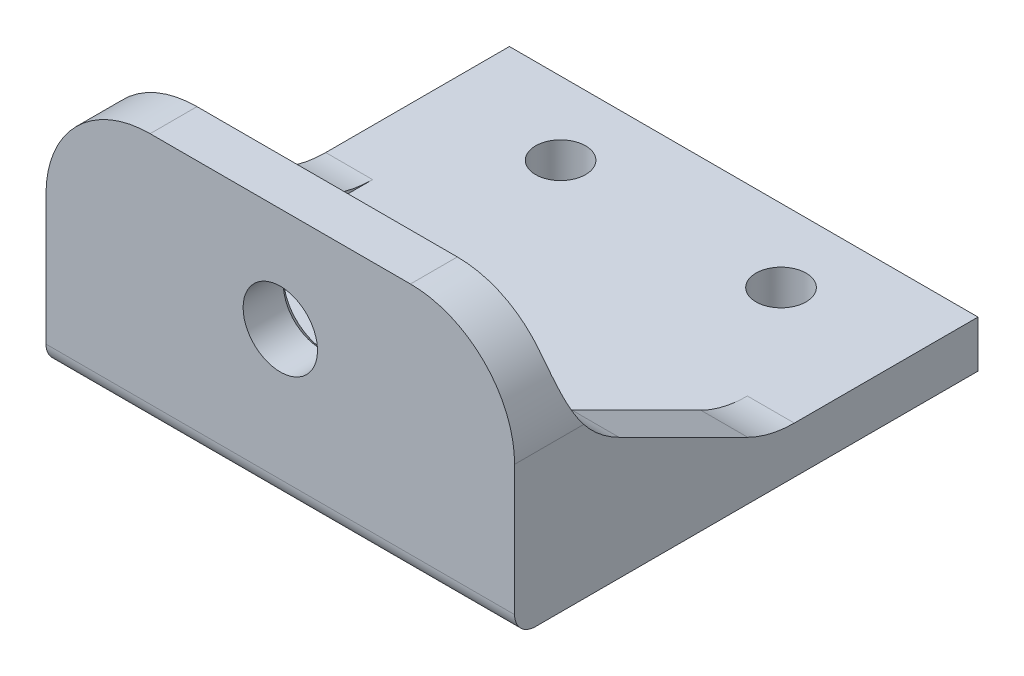
ISO-10303-21;
HEADER;
FILE_DESCRIPTION(('STEP AP214'),'2;1');
FILE_NAME('part.step','',(''),(''),'','','');
FILE_SCHEMA(('AUTOMOTIVE_DESIGN { 1 0 10303 214 1 1 1 1 }'));
ENDSEC;
DATA;
#1=APPLICATION_CONTEXT('core data for automotive mechanical design processes');
#2=APPLICATION_PROTOCOL_DEFINITION('international standard','automotive_design',2000,#1);
#3=PRODUCT_CONTEXT('',#1,'mechanical');
#4=PRODUCT('Part','Part','',(#3));
#5=PRODUCT_RELATED_PRODUCT_CATEGORY('part','',(#4));
#6=PRODUCT_DEFINITION_FORMATION('','',#4);
#7=PRODUCT_DEFINITION_CONTEXT('part definition',#1,'design');
#8=PRODUCT_DEFINITION('design','',#6,#7);
#9=PRODUCT_DEFINITION_SHAPE('','',#8);
#10=(LENGTH_UNIT() NAMED_UNIT(*) SI_UNIT(.MILLI.,.METRE.));
#11=(NAMED_UNIT(*) PLANE_ANGLE_UNIT() SI_UNIT($,.RADIAN.));
#12=(NAMED_UNIT(*) SI_UNIT($,.STERADIAN.) SOLID_ANGLE_UNIT());
#13=UNCERTAINTY_MEASURE_WITH_UNIT(LENGTH_MEASURE(1.E-05),#10,'distance_accuracy_value','');
#14=(GEOMETRIC_REPRESENTATION_CONTEXT(3) GLOBAL_UNCERTAINTY_ASSIGNED_CONTEXT((#13)) GLOBAL_UNIT_ASSIGNED_CONTEXT((#10,
#11,#12)) REPRESENTATION_CONTEXT('',''));
#15=CARTESIAN_POINT('',(0.,0.,0.));
#16=DIRECTION('',(0.,0.,1.));
#17=DIRECTION('',(1.,0.,0.));
#18=AXIS2_PLACEMENT_3D('',#15,#16,#17);
#19=CARTESIAN_POINT('',(0.,4.5,0.));
#20=DIRECTION('',(0.,1.,0.));
#21=DIRECTION('',(0.,0.,1.));
#22=AXIS2_PLACEMENT_3D('',#19,#20,#21);
#23=PLANE('',#22);
#24=CARTESIAN_POINT('',(-10.58478565,4.5,44.5));
#25=DIRECTION('',(0.,1.,0.));
#26=DIRECTION('',(0.,0.,1.));
#27=AXIS2_PLACEMENT_3D('',#24,#25,#26);
#28=CIRCLE('',#27,2.4);
#29=CARTESIAN_POINT('',(-10.58478565,4.5,46.9));
#30=VERTEX_POINT('',#29);
#31=EDGE_CURVE('E369',#30,#30,#28,.T.);
#32=ORIENTED_EDGE('',*,*,#31,.F.);
#33=EDGE_LOOP('',(#32));
#34=FACE_BOUND('',#33,.T.);
#35=CARTESIAN_POINT('',(10.58478565,4.5,44.5));
#36=DIRECTION('',(0.,1.,0.));
#37=DIRECTION('',(0.,0.,1.));
#38=AXIS2_PLACEMENT_3D('',#35,#36,#37);
#39=CIRCLE('',#38,2.4);
#40=CARTESIAN_POINT('',(10.58478565,4.5,46.9));
#41=VERTEX_POINT('',#40);
#42=EDGE_CURVE('E363',#41,#41,#39,.T.);
#43=ORIENTED_EDGE('',*,*,#42,.F.);
#44=EDGE_LOOP('',(#43));
#45=FACE_BOUND('',#44,.T.);
#46=DIRECTION('',(0.,0.,1.));
#47=VECTOR('',#46,1.);
#48=CARTESIAN_POINT('',(18.,4.5,57.5));
#49=LINE('',#48,#47);
#50=CARTESIAN_POINT('',(18.,4.5,55.1393202250021));
#51=VERTEX_POINT('',#50);
#52=CARTESIAN_POINT('',(18.,4.5,75.5));
#53=VERTEX_POINT('',#52);
#54=EDGE_CURVE('E165',#51,#53,#49,.T.);
#55=ORIENTED_EDGE('',*,*,#54,.F.);
#56=DIRECTION('',(1.,0.,0.));
#57=VECTOR('',#56,1.);
#58=CARTESIAN_POINT('',(0.,4.5,55.1393202250021));
#59=LINE('',#58,#57);
#60=CARTESIAN_POINT('',(22.5,4.5,55.1393202250021));
#61=VERTEX_POINT('',#60);
#62=EDGE_CURVE('E170',#51,#61,#59,.T.);
#63=ORIENTED_EDGE('',*,*,#62,.T.);
#64=DIRECTION('',(0.,0.,-1.));
#65=VECTOR('',#64,1.);
#66=CARTESIAN_POINT('',(22.5,4.5,77.5));
#67=LINE('',#66,#65);
#68=CARTESIAN_POINT('',(22.5,4.5,37.5));
#69=VERTEX_POINT('',#68);
#70=EDGE_CURVE('E336',#61,#69,#67,.T.);
#71=ORIENTED_EDGE('',*,*,#70,.T.);
#72=DIRECTION('',(-1.,0.,0.));
#73=VECTOR('',#72,1.);
#74=CARTESIAN_POINT('',(0.,4.5,37.5));
#75=LINE('',#74,#73);
#76=CARTESIAN_POINT('',(-22.5,4.5,37.5));
#77=VERTEX_POINT('',#76);
#78=EDGE_CURVE('E357',#69,#77,#75,.T.);
#79=ORIENTED_EDGE('',*,*,#78,.T.);
#80=DIRECTION('',(0.,0.,1.));
#81=VECTOR('',#80,1.);
#82=CARTESIAN_POINT('',(-22.5,4.5,77.5));
#83=LINE('',#82,#81);
#84=CARTESIAN_POINT('',(-22.5,4.5,55.1393202250021));
#85=VERTEX_POINT('',#84);
#86=EDGE_CURVE('E333',#77,#85,#83,.T.);
#87=ORIENTED_EDGE('',*,*,#86,.T.);
#88=DIRECTION('',(-1.,0.,0.));
#89=VECTOR('',#88,1.);
#90=CARTESIAN_POINT('',(-18.,4.5,55.1393202250021));
#91=LINE('',#90,#89);
#92=CARTESIAN_POINT('',(-18.,4.5,55.1393202250021));
#93=VERTEX_POINT('',#92);
#94=EDGE_CURVE('E200',#85,#93,#91,.F.);
#95=ORIENTED_EDGE('',*,*,#94,.T.);
#96=DIRECTION('',(0.,0.,1.));
#97=VECTOR('',#96,1.);
#98=CARTESIAN_POINT('',(-18.,4.5,57.5));
#99=LINE('',#98,#97);
#100=CARTESIAN_POINT('',(-18.,4.5,75.5));
#101=VERTEX_POINT('',#100);
#102=EDGE_CURVE('E374',#93,#101,#99,.T.);
#103=ORIENTED_EDGE('',*,*,#102,.T.);
#104=DIRECTION('',(1.,0.,0.));
#105=VECTOR('',#104,1.);
#106=CARTESIAN_POINT('',(0.,4.5,75.5));
#107=LINE('',#106,#105);
#108=EDGE_CURVE('E187',#101,#53,#107,.T.);
#109=ORIENTED_EDGE('',*,*,#108,.T.);
#110=EDGE_LOOP('',(#55,#63,#71,#79,#87,#95,#103,#109));
#111=FACE_BOUND('',#110,.T.);
#112=ADVANCED_FACE('F38',(#34,#45,#111),#23,.T.);
#113=CARTESIAN_POINT('',(0.,0.,77.5));
#114=DIRECTION('',(0.,0.,1.));
#115=DIRECTION('',(1.,0.,0.));
#116=AXIS2_PLACEMENT_3D('',#113,#114,#115);
#117=PLANE('',#116);
#118=CARTESIAN_POINT('',(0.,14.5,77.5));
#119=DIRECTION('',(0.,0.,-1.));
#120=DIRECTION('',(-1.,0.,0.));
#121=AXIS2_PLACEMENT_3D('',#118,#119,#120);
#122=CIRCLE('',#121,4.20624);
#123=CARTESIAN_POINT('',(-4.20624,14.5,77.5));
#124=VERTEX_POINT('',#123);
#125=EDGE_CURVE('E354',#124,#124,#122,.T.);
#126=ORIENTED_EDGE('',*,*,#125,.F.);
#127=EDGE_LOOP('',(#126));
#128=FACE_BOUND('',#127,.T.);
#129=CARTESIAN_POINT('',(12.5,14.5,77.5));
#130=DIRECTION('',(0.,0.,1.));
#131=DIRECTION('',(1.,0.,0.));
#132=AXIS2_PLACEMENT_3D('',#129,#130,#131);
#133=CIRCLE('',#132,10.);
#134=CARTESIAN_POINT('',(12.5,24.5,77.5));
#135=VERTEX_POINT('',#134);
#136=CARTESIAN_POINT('',(20.3615137775742,20.680339887499,77.5));
#137=VERTEX_POINT('',#136);
#138=EDGE_CURVE('E287',#135,#137,#133,.F.);
#139=ORIENTED_EDGE('',*,*,#138,.T.);
#140=DIRECTION('',(1.,0.,0.));
#141=VECTOR('',#140,1.);
#142=CARTESIAN_POINT('',(18.,20.680339887499,77.5));
#143=LINE('',#142,#141);
#144=CARTESIAN_POINT('',(18.,20.680339887499,77.5));
#145=VERTEX_POINT('',#144);
#146=EDGE_CURVE('E179',#137,#145,#143,.F.);
#147=ORIENTED_EDGE('',*,*,#146,.T.);
#148=DIRECTION('',(0.,1.,0.));
#149=VECTOR('',#148,1.);
#150=CARTESIAN_POINT('',(18.,4.5,77.5));
#151=LINE('',#150,#149);
#152=CARTESIAN_POINT('',(18.,6.5,77.5));
#153=VERTEX_POINT('',#152);
#154=EDGE_CURVE('E61',#153,#145,#151,.T.);
#155=ORIENTED_EDGE('',*,*,#154,.F.);
#156=DIRECTION('',(1.,0.,0.));
#157=VECTOR('',#156,1.);
#158=CARTESIAN_POINT('',(0.,6.5,77.5));
#159=LINE('',#158,#157);
#160=CARTESIAN_POINT('',(-18.,6.5,77.5));
#161=VERTEX_POINT('',#160);
#162=EDGE_CURVE('E176',#153,#161,#159,.F.);
#163=ORIENTED_EDGE('',*,*,#162,.T.);
#164=DIRECTION('',(0.,1.,0.));
#165=VECTOR('',#164,1.);
#166=CARTESIAN_POINT('',(-18.,4.5,77.5));
#167=LINE('',#166,#165);
#168=CARTESIAN_POINT('',(-18.,20.680339887499,77.5));
#169=VERTEX_POINT('',#168);
#170=EDGE_CURVE('E276',#161,#169,#167,.T.);
#171=ORIENTED_EDGE('',*,*,#170,.T.);
#172=DIRECTION('',(-1.,0.,0.));
#173=VECTOR('',#172,1.);
#174=CARTESIAN_POINT('',(0.,20.680339887499,77.5));
#175=LINE('',#174,#173);
#176=CARTESIAN_POINT('',(-20.3615137775742,20.680339887499,77.5));
#177=VERTEX_POINT('',#176);
#178=EDGE_CURVE('E203',#169,#177,#175,.T.);
#179=ORIENTED_EDGE('',*,*,#178,.T.);
#180=CARTESIAN_POINT('',(-12.5,14.5,77.5));
#181=DIRECTION('',(0.,0.,1.));
#182=DIRECTION('',(1.,0.,0.));
#183=AXIS2_PLACEMENT_3D('',#180,#181,#182);
#184=CIRCLE('',#183,10.);
#185=CARTESIAN_POINT('',(-12.5,24.5,77.5));
#186=VERTEX_POINT('',#185);
#187=EDGE_CURVE('E281',#177,#186,#184,.F.);
#188=ORIENTED_EDGE('',*,*,#187,.T.);
#189=DIRECTION('',(-1.,0.,0.));
#190=VECTOR('',#189,1.);
#191=CARTESIAN_POINT('',(22.5,24.5,77.5));
#192=LINE('',#191,#190);
#193=EDGE_CURVE('E344',#135,#186,#192,.T.);
#194=ORIENTED_EDGE('',*,*,#193,.F.);
#195=EDGE_LOOP('',(#139,#147,#155,#163,#171,#179,#188,#194));
#196=FACE_BOUND('',#195,.T.);
#197=ADVANCED_FACE('F175',(#128,#196),#117,.F.);
#198=CARTESIAN_POINT('',(-22.5,4.5,77.5));
#199=DIRECTION('',(1.,0.,0.));
#200=DIRECTION('',(0.,0.,-1.));
#201=AXIS2_PLACEMENT_3D('',#198,#199,#200);
#202=PLANE('',#201);
#203=DIRECTION('',(0.,0.,-1.));
#204=VECTOR('',#203,1.);
#205=CARTESIAN_POINT('',(-22.5,14.5,77.5));
#206=LINE('',#205,#204);
#207=CARTESIAN_POINT('',(-22.5,14.5,82.));
#208=VERTEX_POINT('',#207);
#209=CARTESIAN_POINT('',(-22.5,14.5,75.3615137775742));
#210=VERTEX_POINT('',#209);
#211=EDGE_CURVE('E269',#208,#210,#206,.T.);
#212=ORIENTED_EDGE('',*,*,#211,.T.);
#213=CARTESIAN_POINT('',(-22.5,20.680339887499,67.5));
#214=DIRECTION('',(1.,0.,0.));
#215=DIRECTION('',(0.,0.,-1.));
#216=AXIS2_PLACEMENT_3D('',#213,#214,#215);
#217=CIRCLE('',#216,10.);
#218=CARTESIAN_POINT('',(-22.5,11.7360679774998,71.9721359549996));
#219=VERTEX_POINT('',#218);
#220=EDGE_CURVE('E219',#210,#219,#217,.T.);
#221=ORIENTED_EDGE('',*,*,#220,.T.);
#222=DIRECTION('',(0.,-0.447213595499958,-0.894427190999916));
#223=VECTOR('',#222,1.);
#224=CARTESIAN_POINT('',(-22.5,14.5,77.5));
#225=LINE('',#224,#223);
#226=CARTESIAN_POINT('',(-22.5,5.55572809000084,59.6114561800017));
#227=VERTEX_POINT('',#226);
#228=EDGE_CURVE('E266',#219,#227,#225,.T.);
#229=ORIENTED_EDGE('',*,*,#228,.T.);
#230=CARTESIAN_POINT('',(-22.5,14.5,55.1393202250021));
#231=DIRECTION('',(1.,0.,0.));
#232=DIRECTION('',(0.,0.,-1.));
#233=AXIS2_PLACEMENT_3D('',#230,#231,#232);
#234=CIRCLE('',#233,10.);
#235=EDGE_CURVE('E206',#227,#85,#234,.T.);
#236=ORIENTED_EDGE('',*,*,#235,.T.);
#237=ORIENTED_EDGE('',*,*,#86,.F.);
#238=DIRECTION('',(0.,1.,0.));
#239=VECTOR('',#238,1.);
#240=CARTESIAN_POINT('',(-22.5,4.5,37.5));
#241=LINE('',#240,#239);
#242=CARTESIAN_POINT('',(-22.5,0.,37.5));
#243=VERTEX_POINT('',#242);
#244=EDGE_CURVE('E359',#243,#77,#241,.T.);
#245=ORIENTED_EDGE('',*,*,#244,.F.);
#246=DIRECTION('',(0.,0.,1.));
#247=VECTOR('',#246,1.);
#248=CARTESIAN_POINT('',(-22.5,0.,77.5));
#249=LINE('',#248,#247);
#250=CARTESIAN_POINT('',(-22.5,0.,80.));
#251=VERTEX_POINT('',#250);
#252=EDGE_CURVE('E312',#243,#251,#249,.T.);
#253=ORIENTED_EDGE('',*,*,#252,.T.);
#254=CARTESIAN_POINT('',(-22.5,2.,80.));
#255=DIRECTION('',(1.,0.,0.));
#256=DIRECTION('',(0.,0.,-1.));
#257=AXIS2_PLACEMENT_3D('',#254,#255,#256);
#258=CIRCLE('',#257,2.);
#259=CARTESIAN_POINT('',(-22.5,2.,82.));
#260=VERTEX_POINT('',#259);
#261=EDGE_CURVE('E190',#251,#260,#258,.F.);
#262=ORIENTED_EDGE('',*,*,#261,.T.);
#263=DIRECTION('',(0.,-1.,0.));
#264=VECTOR('',#263,1.);
#265=CARTESIAN_POINT('',(-22.5,0.,82.));
#266=LINE('',#265,#264);
#267=EDGE_CURVE('E309',#208,#260,#266,.T.);
#268=ORIENTED_EDGE('',*,*,#267,.F.);
#269=EDGE_LOOP('',(#212,#221,#229,#236,#237,#245,#253,#262,#268));
#270=FACE_BOUND('',#269,.T.);
#271=ADVANCED_FACE('F232',(#270),#202,.F.);
#272=CARTESIAN_POINT('',(22.5,4.5,77.5));
#273=DIRECTION('',(-1.,0.,0.));
#274=DIRECTION('',(0.,0.,1.));
#275=AXIS2_PLACEMENT_3D('',#272,#273,#274);
#276=PLANE('',#275);
#277=ORIENTED_EDGE('',*,*,#70,.F.);
#278=CARTESIAN_POINT('',(22.5,14.5,55.1393202250021));
#279=DIRECTION('',(-1.,0.,0.));
#280=DIRECTION('',(0.,0.,1.));
#281=AXIS2_PLACEMENT_3D('',#278,#279,#280);
#282=CIRCLE('',#281,10.);
#283=CARTESIAN_POINT('',(22.5,5.55572809000084,59.6114561800017));
#284=VERTEX_POINT('',#283);
#285=EDGE_CURVE('E248',#61,#284,#282,.T.);
#286=ORIENTED_EDGE('',*,*,#285,.T.);
#287=DIRECTION('',(0.,-0.447213595499958,-0.894427190999916));
#288=VECTOR('',#287,1.);
#289=CARTESIAN_POINT('',(22.5,14.5,77.5));
#290=LINE('',#289,#288);
#291=CARTESIAN_POINT('',(22.5,11.7360679774998,71.9721359549996));
#292=VERTEX_POINT('',#291);
#293=EDGE_CURVE('E181',#292,#284,#290,.T.);
#294=ORIENTED_EDGE('',*,*,#293,.F.);
#295=CARTESIAN_POINT('',(22.5,20.680339887499,67.5));
#296=DIRECTION('',(-1.,0.,0.));
#297=DIRECTION('',(0.,0.,1.));
#298=AXIS2_PLACEMENT_3D('',#295,#296,#297);
#299=CIRCLE('',#298,10.);
#300=CARTESIAN_POINT('',(22.5,14.5,75.3615137775742));
#301=VERTEX_POINT('',#300);
#302=EDGE_CURVE('E244',#292,#301,#299,.T.);
#303=ORIENTED_EDGE('',*,*,#302,.T.);
#304=DIRECTION('',(0.,0.,-1.));
#305=VECTOR('',#304,1.);
#306=CARTESIAN_POINT('',(22.5,14.5,77.5));
#307=LINE('',#306,#305);
#308=CARTESIAN_POINT('',(22.5,14.5,82.));
#309=VERTEX_POINT('',#308);
#310=EDGE_CURVE('E54',#301,#309,#307,.F.);
#311=ORIENTED_EDGE('',*,*,#310,.T.);
#312=DIRECTION('',(0.,1.,0.));
#313=VECTOR('',#312,1.);
#314=CARTESIAN_POINT('',(22.5,0.,82.));
#315=LINE('',#314,#313);
#316=CARTESIAN_POINT('',(22.5,2.,82.));
#317=VERTEX_POINT('',#316);
#318=EDGE_CURVE('E329',#317,#309,#315,.T.);
#319=ORIENTED_EDGE('',*,*,#318,.F.);
#320=CARTESIAN_POINT('',(22.5,2.,80.));
#321=DIRECTION('',(-1.,0.,0.));
#322=DIRECTION('',(0.,0.,1.));
#323=AXIS2_PLACEMENT_3D('',#320,#321,#322);
#324=CIRCLE('',#323,2.);
#325=CARTESIAN_POINT('',(22.5,0.,80.));
#326=VERTEX_POINT('',#325);
#327=EDGE_CURVE('E303',#317,#326,#324,.F.);
#328=ORIENTED_EDGE('',*,*,#327,.T.);
#329=DIRECTION('',(0.,0.,-1.));
#330=VECTOR('',#329,1.);
#331=CARTESIAN_POINT('',(22.5,0.,77.5));
#332=LINE('',#331,#330);
#333=CARTESIAN_POINT('',(22.5,0.,37.5));
#334=VERTEX_POINT('',#333);
#335=EDGE_CURVE('E328',#326,#334,#332,.T.);
#336=ORIENTED_EDGE('',*,*,#335,.T.);
#337=DIRECTION('',(0.,-1.,0.));
#338=VECTOR('',#337,1.);
#339=CARTESIAN_POINT('',(22.5,4.5,37.5));
#340=LINE('',#339,#338);
#341=EDGE_CURVE('E361',#69,#334,#340,.T.);
#342=ORIENTED_EDGE('',*,*,#341,.F.);
#343=EDGE_LOOP('',(#277,#286,#294,#303,#311,#319,#328,#336,#342));
#344=FACE_BOUND('',#343,.T.);
#345=ADVANCED_FACE('F326',(#344),#276,.F.);
#346=CARTESIAN_POINT('',(0.,0.,0.));
#347=DIRECTION('',(0.,1.,0.));
#348=DIRECTION('',(0.,0.,1.));
#349=AXIS2_PLACEMENT_3D('',#346,#347,#348);
#350=PLANE('',#349);
#351=CARTESIAN_POINT('',(-10.58478565,0.,44.5));
#352=DIRECTION('',(0.,-1.,0.));
#353=DIRECTION('',(0.,0.,-1.));
#354=AXIS2_PLACEMENT_3D('',#351,#352,#353);
#355=CIRCLE('',#354,2.4);
#356=CARTESIAN_POINT('',(-10.58478565,0.,42.1));
#357=VERTEX_POINT('',#356);
#358=EDGE_CURVE('E372',#357,#357,#355,.T.);
#359=ORIENTED_EDGE('',*,*,#358,.F.);
#360=EDGE_LOOP('',(#359));
#361=FACE_BOUND('',#360,.T.);
#362=CARTESIAN_POINT('',(10.58478565,0.,44.5));
#363=DIRECTION('',(0.,-1.,0.));
#364=DIRECTION('',(0.,0.,-1.));
#365=AXIS2_PLACEMENT_3D('',#362,#363,#364);
#366=CIRCLE('',#365,2.4);
#367=CARTESIAN_POINT('',(10.58478565,0.,42.1));
#368=VERTEX_POINT('',#367);
#369=EDGE_CURVE('E366',#368,#368,#366,.T.);
#370=ORIENTED_EDGE('',*,*,#369,.F.);
#371=EDGE_LOOP('',(#370));
#372=FACE_BOUND('',#371,.T.);
#373=DIRECTION('',(-1.,0.,0.));
#374=VECTOR('',#373,1.);
#375=CARTESIAN_POINT('',(0.,0.,37.5));
#376=LINE('',#375,#374);
#377=EDGE_CURVE('E186',#334,#243,#376,.T.);
#378=ORIENTED_EDGE('',*,*,#377,.F.);
#379=ORIENTED_EDGE('',*,*,#335,.F.);
#380=DIRECTION('',(1.,0.,0.));
#381=VECTOR('',#380,1.);
#382=CARTESIAN_POINT('',(-22.5,0.,80.));
#383=LINE('',#382,#381);
#384=EDGE_CURVE('E305',#326,#251,#383,.F.);
#385=ORIENTED_EDGE('',*,*,#384,.T.);
#386=ORIENTED_EDGE('',*,*,#252,.F.);
#387=EDGE_LOOP('',(#378,#379,#385,#386));
#388=FACE_BOUND('',#387,.T.);
#389=ADVANCED_FACE('F332',(#361,#372,#388),#350,.F.);
#390=CARTESIAN_POINT('',(22.5,24.5,82.));
#391=DIRECTION('',(0.,-1.,0.));
#392=DIRECTION('',(1.,0.,0.));
#393=AXIS2_PLACEMENT_3D('',#390,#391,#392);
#394=PLANE('',#393);
#395=ORIENTED_EDGE('',*,*,#193,.T.);
#396=DIRECTION('',(0.,0.,-1.));
#397=VECTOR('',#396,1.);
#398=CARTESIAN_POINT('',(-12.5,24.5,82.));
#399=LINE('',#398,#397);
#400=CARTESIAN_POINT('',(-12.5,24.5,82.));
#401=VERTEX_POINT('',#400);
#402=EDGE_CURVE('E285',#186,#401,#399,.F.);
#403=ORIENTED_EDGE('',*,*,#402,.T.);
#404=DIRECTION('',(-1.,0.,0.));
#405=VECTOR('',#404,1.);
#406=CARTESIAN_POINT('',(22.5,24.5,82.));
#407=LINE('',#406,#405);
#408=CARTESIAN_POINT('',(12.5,24.5,82.));
#409=VERTEX_POINT('',#408);
#410=EDGE_CURVE('E320',#409,#401,#407,.T.);
#411=ORIENTED_EDGE('',*,*,#410,.F.);
#412=DIRECTION('',(0.,0.,-1.));
#413=VECTOR('',#412,1.);
#414=CARTESIAN_POINT('',(12.5,24.5,82.));
#415=LINE('',#414,#413);
#416=EDGE_CURVE('E286',#409,#135,#415,.T.);
#417=ORIENTED_EDGE('',*,*,#416,.T.);
#418=EDGE_LOOP('',(#395,#403,#411,#417));
#419=FACE_BOUND('',#418,.T.);
#420=ADVANCED_FACE('F426',(#419),#394,.F.);
#421=CARTESIAN_POINT('',(0.,0.,82.));
#422=DIRECTION('',(0.,0.,1.));
#423=DIRECTION('',(1.,0.,0.));
#424=AXIS2_PLACEMENT_3D('',#421,#422,#423);
#425=PLANE('',#424);
#426=CARTESIAN_POINT('',(0.,14.5,82.));
#427=DIRECTION('',(0.,0.,-1.));
#428=DIRECTION('',(-1.,0.,0.));
#429=AXIS2_PLACEMENT_3D('',#426,#427,#428);
#430=CIRCLE('',#429,3.57124);
#431=CARTESIAN_POINT('',(-3.57124,14.5,82.));
#432=VERTEX_POINT('',#431);
#433=EDGE_CURVE('E345',#432,#432,#430,.T.);
#434=ORIENTED_EDGE('',*,*,#433,.T.);
#435=EDGE_LOOP('',(#434));
#436=FACE_BOUND('',#435,.T.);
#437=ORIENTED_EDGE('',*,*,#267,.T.);
#438=DIRECTION('',(1.,0.,0.));
#439=VECTOR('',#438,1.);
#440=CARTESIAN_POINT('',(22.5,2.,82.));
#441=LINE('',#440,#439);
#442=EDGE_CURVE('E300',#260,#317,#441,.T.);
#443=ORIENTED_EDGE('',*,*,#442,.T.);
#444=ORIENTED_EDGE('',*,*,#318,.T.);
#445=CARTESIAN_POINT('',(12.5,14.5,82.));
#446=DIRECTION('',(0.,0.,1.));
#447=DIRECTION('',(1.,0.,0.));
#448=AXIS2_PLACEMENT_3D('',#445,#446,#447);
#449=CIRCLE('',#448,10.);
#450=EDGE_CURVE('E295',#309,#409,#449,.T.);
#451=ORIENTED_EDGE('',*,*,#450,.T.);
#452=ORIENTED_EDGE('',*,*,#410,.T.);
#453=CARTESIAN_POINT('',(-12.5,14.5,82.));
#454=DIRECTION('',(0.,0.,1.));
#455=DIRECTION('',(1.,0.,0.));
#456=AXIS2_PLACEMENT_3D('',#453,#454,#455);
#457=CIRCLE('',#456,10.);
#458=EDGE_CURVE('E297',#401,#208,#457,.T.);
#459=ORIENTED_EDGE('',*,*,#458,.T.);
#460=EDGE_LOOP('',(#437,#443,#444,#451,#452,#459));
#461=FACE_BOUND('',#460,.T.);
#462=ADVANCED_FACE('F317',(#436,#461),#425,.T.);
#463=CARTESIAN_POINT('',(0.,14.5,77.5));
#464=DIRECTION('',(0.,0.,-1.));
#465=DIRECTION('',(-1.,0.,0.));
#466=AXIS2_PLACEMENT_3D('',#463,#464,#465);
#467=CYLINDRICAL_SURFACE('',#466,3.57124);
#468=ORIENTED_EDGE('',*,*,#433,.F.);
#469=EDGE_LOOP('',(#468));
#470=FACE_BOUND('',#469,.T.);
#471=CARTESIAN_POINT('',(0.,14.5,78.135));
#472=DIRECTION('',(0.,0.,-1.));
#473=DIRECTION('',(-1.,0.,0.));
#474=AXIS2_PLACEMENT_3D('',#471,#472,#473);
#475=CIRCLE('',#474,3.57124);
#476=CARTESIAN_POINT('',(-3.57124,14.5,78.135));
#477=VERTEX_POINT('',#476);
#478=EDGE_CURVE('E351',#477,#477,#475,.T.);
#479=ORIENTED_EDGE('',*,*,#478,.T.);
#480=EDGE_LOOP('',(#479));
#481=FACE_BOUND('',#480,.T.);
#482=ADVANCED_FACE('F610',(#470,#481),#467,.F.);
#483=CARTESIAN_POINT('',(0.,14.5,77.5));
#484=DIRECTION('',(0.,0.,-1.));
#485=DIRECTION('',(-1.,0.,0.));
#486=AXIS2_PLACEMENT_3D('',#483,#484,#485);
#487=CONICAL_SURFACE('',#486,4.20624,0.785398163397453);
#488=ORIENTED_EDGE('',*,*,#478,.F.);
#489=EDGE_LOOP('',(#488));
#490=FACE_BOUND('',#489,.T.);
#491=ORIENTED_EDGE('',*,*,#125,.T.);
#492=EDGE_LOOP('',(#491));
#493=FACE_BOUND('',#492,.T.);
#494=ADVANCED_FACE('F230',(#490,#493),#487,.F.);
#495=CARTESIAN_POINT('',(-12.5,14.5,77.5));
#496=DIRECTION('',(0.,0.,-1.));
#497=DIRECTION('',(-1.,0.,0.));
#498=AXIS2_PLACEMENT_3D('',#495,#496,#497);
#499=CYLINDRICAL_SURFACE('',#498,10.);
#500=ORIENTED_EDGE('',*,*,#458,.F.);
#501=ORIENTED_EDGE('',*,*,#402,.F.);
#502=ORIENTED_EDGE('',*,*,#187,.F.);
#503=CARTESIAN_POINT('',(-20.3615137775742,20.680339887499,77.5));
#504=CARTESIAN_POINT('',(-20.4955409797638,20.5099135010908,77.5000213009278));
#505=CARTESIAN_POINT('',(-20.6240026394915,20.3350417037825,77.4956434936065));
#506=CARTESIAN_POINT('',(-20.869144977533,19.9776096868465,77.4768785403062));
#507=CARTESIAN_POINT('',(-20.9858191768488,19.7950453162614,77.4624859235798));
#508=CARTESIAN_POINT('',(-21.2063550267192,19.4240126728737,77.4225198900962));
#509=CARTESIAN_POINT('',(-21.3102432640981,19.2355577090004,77.3969701944148));
#510=CARTESIAN_POINT('',(-21.5049088494678,18.8540162733463,77.3337131924746));
#511=CARTESIAN_POINT('',(-21.5956891411198,18.6609308528238,77.2960086220125));
#512=CARTESIAN_POINT('',(-21.7641684896083,18.2710064054269,77.2074844102202));
#513=CARTESIAN_POINT('',(-21.8418078190162,18.0741545399465,77.1566074127524));
#514=CARTESIAN_POINT('',(-21.983406137235,17.6794607512868,77.0413307024294));
#515=CARTESIAN_POINT('',(-22.0473635574943,17.4816187172484,76.9769294407713));
#516=CARTESIAN_POINT('',(-22.1617456386443,17.0870547236779,76.834467369738));
#517=CARTESIAN_POINT('',(-22.212176109228,16.8903323189234,76.7564124483511));
#518=CARTESIAN_POINT('',(-22.3000242156456,16.4998884599402,76.5867547644826));
#519=CARTESIAN_POINT('',(-22.3374444259394,16.3061664192592,76.4951546874247));
#520=CARTESIAN_POINT('',(-22.3918988435462,15.9733991868272,76.3243988087439));
#521=CARTESIAN_POINT('',(-22.4117043457575,15.8332611883676,76.2482206989555));
#522=CARTESIAN_POINT('',(-22.445039908925,15.556238258137,76.0888944837087));
#523=CARTESIAN_POINT('',(-22.4585701390112,15.4193532387865,76.0057465661705));
#524=CARTESIAN_POINT('',(-22.479803787903,15.149482366041,75.8327836374177));
#525=CARTESIAN_POINT('',(-22.4875094194241,15.0164950504153,75.7429711722618));
#526=CARTESIAN_POINT('',(-22.4976100573518,14.7548670572613,75.5569587662049));
#527=CARTESIAN_POINT('',(-22.5000054262029,14.62622608367,75.4607592617037));
#528=CARTESIAN_POINT('',(-22.5,14.5,75.3615137775742));
#529=B_SPLINE_CURVE_WITH_KNOTS('',3,(#503,#504,#505,#506,#507,#508,#509,#510,#511,#512,#513,
#514,#515,#516,#517,#518,#519,#520,#521,#522,#523,#524,#525,#526,#527,#528),.UNSPECIFIED.,.F.,
.F.,(4,2,2,2,2,2,2,2,2,2,2,2,4),(0.,0.650364370525214,1.30108429202173,1.95042740242123,
2.59962446179356,3.25169727732132,3.90384480919341,4.55571179993904,5.20744972625368,
5.6893467319577,6.17123074890847,6.65293161008517,7.13459959243585),.UNSPECIFIED.);
#530=EDGE_CURVE('E210',#177,#210,#529,.T.);
#531=ORIENTED_EDGE('',*,*,#530,.T.);
#532=ORIENTED_EDGE('',*,*,#211,.F.);
#533=EDGE_LOOP('',(#500,#501,#502,#531,#532));
#534=FACE_BOUND('',#533,.T.);
#535=ADVANCED_FACE('F224',(#534),#499,.T.);
#536=CARTESIAN_POINT('',(12.5,14.5,82.));
#537=DIRECTION('',(0.,0.,-1.));
#538=DIRECTION('',(-1.,0.,0.));
#539=AXIS2_PLACEMENT_3D('',#536,#537,#538);
#540=CYLINDRICAL_SURFACE('',#539,10.);
#541=ORIENTED_EDGE('',*,*,#450,.F.);
#542=ORIENTED_EDGE('',*,*,#310,.F.);
#543=CARTESIAN_POINT('',(22.5,14.5,75.3615137775742));
#544=CARTESIAN_POINT('',(22.5000213009278,14.6704263864081,75.4955409797639));
#545=CARTESIAN_POINT('',(22.4956434936065,14.8452981837164,75.6240026394915));
#546=CARTESIAN_POINT('',(22.4768785403062,15.2027302006524,75.869144977533));
#547=CARTESIAN_POINT('',(22.4624859235798,15.3852945712376,75.9858191768488));
#548=CARTESIAN_POINT('',(22.4225198900962,15.7563272146253,76.2063550267192));
#549=CARTESIAN_POINT('',(22.3969701944148,15.9447821784986,76.3102432640981));
#550=CARTESIAN_POINT('',(22.3337131924746,16.3263236141526,76.5049088494678));
#551=CARTESIAN_POINT('',(22.2960086220125,16.5194090346752,76.5956891411198));
#552=CARTESIAN_POINT('',(22.2074844102201,16.909333482072,76.7641684896083));
#553=CARTESIAN_POINT('',(22.1566074127524,17.1061853475524,76.8418078190163));
#554=CARTESIAN_POINT('',(22.0413307024294,17.5008791362122,76.983406137235));
#555=CARTESIAN_POINT('',(21.9769294407713,17.6987211702506,77.0473635574943));
#556=CARTESIAN_POINT('',(21.834467369738,18.093285163821,77.1617456386443));
#557=CARTESIAN_POINT('',(21.7564124483511,18.2900075685756,77.212176109228));
#558=CARTESIAN_POINT('',(21.5867547644826,18.6804514275588,77.3000242156456));
#559=CARTESIAN_POINT('',(21.4951546874247,18.8741734682398,77.3374444259395));
#560=CARTESIAN_POINT('',(21.3243988087439,19.2069407006718,77.3918988435462));
#561=CARTESIAN_POINT('',(21.2482206989555,19.3470786991313,77.4117043457575));
#562=CARTESIAN_POINT('',(21.0888944837087,19.624101629362,77.445039908925));
#563=CARTESIAN_POINT('',(21.0057465661705,19.7609866487124,77.4585701390112));
#564=CARTESIAN_POINT('',(20.8327836374177,20.0308575214579,77.479803787903));
#565=CARTESIAN_POINT('',(20.7429711722618,20.1638448370837,77.4875094194241));
#566=CARTESIAN_POINT('',(20.5569587662049,20.4254728302376,77.4976100573518));
#567=CARTESIAN_POINT('',(20.4607592617037,20.554113803829,77.5000054262028));
#568=CARTESIAN_POINT('',(20.3615137775742,20.680339887499,77.5));
#569=B_SPLINE_CURVE_WITH_KNOTS('',3,(#543,#544,#545,#546,#547,#548,#549,#550,#551,#552,#553,
#554,#555,#556,#557,#558,#559,#560,#561,#562,#563,#564,#565,#566,#567,#568),.UNSPECIFIED.,.F.,
.F.,(4,2,2,2,2,2,2,2,2,2,2,2,4),(0.,0.650364370525214,1.30108429202173,1.95042740242123,
2.59962446179357,3.25169727732133,3.90384480919342,4.55571179993904,5.20744972625369,
5.68934673195771,6.17123074890848,6.65293161008518,7.13459959243585),.UNSPECIFIED.);
#570=EDGE_CURVE('E47',#301,#137,#569,.T.);
#571=ORIENTED_EDGE('',*,*,#570,.T.);
#572=ORIENTED_EDGE('',*,*,#138,.F.);
#573=ORIENTED_EDGE('',*,*,#416,.F.);
#574=EDGE_LOOP('',(#541,#542,#571,#572,#573));
#575=FACE_BOUND('',#574,.T.);
#576=ADVANCED_FACE('F229',(#575),#540,.T.);
#577=CARTESIAN_POINT('',(0.,2.,80.));
#578=DIRECTION('',(-1.,0.,0.));
#579=DIRECTION('',(0.,0.,1.));
#580=AXIS2_PLACEMENT_3D('',#577,#578,#579);
#581=CYLINDRICAL_SURFACE('',#580,2.);
#582=ORIENTED_EDGE('',*,*,#261,.F.);
#583=ORIENTED_EDGE('',*,*,#384,.F.);
#584=ORIENTED_EDGE('',*,*,#327,.F.);
#585=ORIENTED_EDGE('',*,*,#442,.F.);
#586=EDGE_LOOP('',(#582,#583,#584,#585));
#587=FACE_BOUND('',#586,.T.);
#588=ADVANCED_FACE('F237',(#587),#581,.T.);
#589=CARTESIAN_POINT('',(0.,6.5,75.5));
#590=DIRECTION('',(1.,0.,0.));
#591=DIRECTION('',(0.,0.,-1.));
#592=AXIS2_PLACEMENT_3D('',#589,#590,#591);
#593=CYLINDRICAL_SURFACE('',#592,2.);
#594=ORIENTED_EDGE('',*,*,#162,.F.);
#595=CARTESIAN_POINT('',(18.,6.5,75.5));
#596=DIRECTION('',(-1.,0.,0.));
#597=DIRECTION('',(0.,0.,1.));
#598=AXIS2_PLACEMENT_3D('',#595,#596,#597);
#599=CIRCLE('',#598,2.);
#600=EDGE_CURVE('E162',#153,#53,#599,.F.);
#601=ORIENTED_EDGE('',*,*,#600,.T.);
#602=ORIENTED_EDGE('',*,*,#108,.F.);
#603=CARTESIAN_POINT('',(-18.,6.5,75.5));
#604=DIRECTION('',(1.,0.,0.));
#605=DIRECTION('',(0.,0.,-1.));
#606=AXIS2_PLACEMENT_3D('',#603,#604,#605);
#607=CIRCLE('',#606,2.);
#608=EDGE_CURVE('E185',#101,#161,#607,.F.);
#609=ORIENTED_EDGE('',*,*,#608,.T.);
#610=EDGE_LOOP('',(#594,#601,#602,#609));
#611=FACE_BOUND('',#610,.T.);
#612=ADVANCED_FACE('F184',(#611),#593,.F.);
#613=CARTESIAN_POINT('',(0.,0.,37.5));
#614=DIRECTION('',(0.,0.,-1.));
#615=DIRECTION('',(-1.,0.,0.));
#616=AXIS2_PLACEMENT_3D('',#613,#614,#615);
#617=PLANE('',#616);
#618=ORIENTED_EDGE('',*,*,#341,.T.);
#619=ORIENTED_EDGE('',*,*,#377,.T.);
#620=ORIENTED_EDGE('',*,*,#244,.T.);
#621=ORIENTED_EDGE('',*,*,#78,.F.);
#622=EDGE_LOOP('',(#618,#619,#620,#621));
#623=FACE_BOUND('',#622,.T.);
#624=ADVANCED_FACE('F395',(#623),#617,.T.);
#625=CARTESIAN_POINT('',(10.58478565,0.,44.5));
#626=DIRECTION('',(0.,-1.,0.));
#627=DIRECTION('',(0.,0.,-1.));
#628=AXIS2_PLACEMENT_3D('',#625,#626,#627);
#629=CYLINDRICAL_SURFACE('',#628,2.4);
#630=ORIENTED_EDGE('',*,*,#42,.T.);
#631=EDGE_LOOP('',(#630));
#632=FACE_BOUND('',#631,.T.);
#633=ORIENTED_EDGE('',*,*,#369,.T.);
#634=EDGE_LOOP('',(#633));
#635=FACE_BOUND('',#634,.T.);
#636=ADVANCED_FACE('F410',(#632,#635),#629,.F.);
#637=CARTESIAN_POINT('',(-10.58478565,0.,44.5));
#638=DIRECTION('',(0.,-1.,0.));
#639=DIRECTION('',(0.,0.,-1.));
#640=AXIS2_PLACEMENT_3D('',#637,#638,#639);
#641=CYLINDRICAL_SURFACE('',#640,2.4);
#642=ORIENTED_EDGE('',*,*,#31,.T.);
#643=EDGE_LOOP('',(#642));
#644=FACE_BOUND('',#643,.T.);
#645=ORIENTED_EDGE('',*,*,#358,.T.);
#646=EDGE_LOOP('',(#645));
#647=FACE_BOUND('',#646,.T.);
#648=ADVANCED_FACE('F403',(#644,#647),#641,.F.);
#649=CARTESIAN_POINT('',(-18.,0.,0.));
#650=DIRECTION('',(1.,0.,0.));
#651=DIRECTION('',(0.,0.,-1.));
#652=AXIS2_PLACEMENT_3D('',#649,#650,#651);
#653=PLANE('',#652);
#654=ORIENTED_EDGE('',*,*,#608,.F.);
#655=ORIENTED_EDGE('',*,*,#102,.F.);
#656=CARTESIAN_POINT('',(-18.,14.5,55.1393202250021));
#657=DIRECTION('',(1.,0.,0.));
#658=DIRECTION('',(0.,0.,-1.));
#659=AXIS2_PLACEMENT_3D('',#656,#657,#658);
#660=CIRCLE('',#659,10.);
#661=CARTESIAN_POINT('',(-18.,5.55572809000084,59.6114561800017));
#662=VERTEX_POINT('',#661);
#663=EDGE_CURVE('E208',#93,#662,#660,.F.);
#664=ORIENTED_EDGE('',*,*,#663,.T.);
#665=DIRECTION('',(0.,-0.447213595499958,-0.894427190999916));
#666=VECTOR('',#665,1.);
#667=CARTESIAN_POINT('',(-18.,14.5,77.5));
#668=LINE('',#667,#666);
#669=CARTESIAN_POINT('',(-18.,11.7360679774998,71.9721359549996));
#670=VERTEX_POINT('',#669);
#671=EDGE_CURVE('E378',#670,#662,#668,.T.);
#672=ORIENTED_EDGE('',*,*,#671,.F.);
#673=CARTESIAN_POINT('',(-18.,20.680339887499,67.5));
#674=DIRECTION('',(1.,0.,0.));
#675=DIRECTION('',(0.,0.,-1.));
#676=AXIS2_PLACEMENT_3D('',#673,#674,#675);
#677=CIRCLE('',#676,10.);
#678=EDGE_CURVE('E171',#670,#169,#677,.F.);
#679=ORIENTED_EDGE('',*,*,#678,.T.);
#680=ORIENTED_EDGE('',*,*,#170,.F.);
#681=EDGE_LOOP('',(#654,#655,#664,#672,#679,#680));
#682=FACE_BOUND('',#681,.T.);
#683=ADVANCED_FACE('F401',(#682),#653,.T.);
#684=CARTESIAN_POINT('',(-18.,14.5,77.5));
#685=DIRECTION('',(0.,0.894427190999916,-0.447213595499958));
#686=DIRECTION('',(0.,0.447213595499958,0.894427190999916));
#687=AXIS2_PLACEMENT_3D('',#684,#685,#686);
#688=PLANE('',#687);
#689=ORIENTED_EDGE('',*,*,#671,.T.);
#690=DIRECTION('',(-1.,0.,0.));
#691=VECTOR('',#690,1.);
#692=CARTESIAN_POINT('',(-22.5,5.55572809000084,59.6114561800017));
#693=LINE('',#692,#691);
#694=EDGE_CURVE('E197',#662,#227,#693,.T.);
#695=ORIENTED_EDGE('',*,*,#694,.T.);
#696=ORIENTED_EDGE('',*,*,#228,.F.);
#697=DIRECTION('',(-1.,0.,0.));
#698=VECTOR('',#697,1.);
#699=CARTESIAN_POINT('',(-18.,11.7360679774998,71.9721359549996));
#700=LINE('',#699,#698);
#701=EDGE_CURVE('E195',#219,#670,#700,.F.);
#702=ORIENTED_EDGE('',*,*,#701,.T.);
#703=EDGE_LOOP('',(#689,#695,#696,#702));
#704=FACE_BOUND('',#703,.T.);
#705=ADVANCED_FACE('F274',(#704),#688,.T.);
#706=CARTESIAN_POINT('',(-18.,14.5,55.1393202250021));
#707=DIRECTION('',(1.,0.,0.));
#708=DIRECTION('',(0.,0.,-1.));
#709=AXIS2_PLACEMENT_3D('',#706,#707,#708);
#710=CYLINDRICAL_SURFACE('',#709,10.);
#711=ORIENTED_EDGE('',*,*,#663,.F.);
#712=ORIENTED_EDGE('',*,*,#94,.F.);
#713=ORIENTED_EDGE('',*,*,#235,.F.);
#714=ORIENTED_EDGE('',*,*,#694,.F.);
#715=EDGE_LOOP('',(#711,#712,#713,#714));
#716=FACE_BOUND('',#715,.T.);
#717=ADVANCED_FACE('F400',(#716),#710,.F.);
#718=CARTESIAN_POINT('',(0.,20.680339887499,67.5));
#719=DIRECTION('',(-1.,0.,0.));
#720=DIRECTION('',(0.,0.,1.));
#721=AXIS2_PLACEMENT_3D('',#718,#719,#720);
#722=CYLINDRICAL_SURFACE('',#721,10.);
#723=ORIENTED_EDGE('',*,*,#678,.F.);
#724=ORIENTED_EDGE('',*,*,#701,.F.);
#725=ORIENTED_EDGE('',*,*,#220,.F.);
#726=ORIENTED_EDGE('',*,*,#530,.F.);
#727=ORIENTED_EDGE('',*,*,#178,.F.);
#728=EDGE_LOOP('',(#723,#724,#725,#726,#727));
#729=FACE_BOUND('',#728,.T.);
#730=ADVANCED_FACE('F221',(#729),#722,.F.);
#731=CARTESIAN_POINT('',(18.,0.,0.));
#732=DIRECTION('',(-1.,0.,0.));
#733=DIRECTION('',(0.,0.,-1.));
#734=AXIS2_PLACEMENT_3D('',#731,#732,#733);
#735=PLANE('',#734);
#736=ORIENTED_EDGE('',*,*,#600,.F.);
#737=ORIENTED_EDGE('',*,*,#154,.T.);
#738=CARTESIAN_POINT('',(18.,20.680339887499,67.5));
#739=DIRECTION('',(-1.,0.,0.));
#740=DIRECTION('',(0.,0.,1.));
#741=AXIS2_PLACEMENT_3D('',#738,#739,#740);
#742=CIRCLE('',#741,10.);
#743=CARTESIAN_POINT('',(18.,11.7360679774998,71.9721359549996));
#744=VERTEX_POINT('',#743);
#745=EDGE_CURVE('E11',#145,#744,#742,.F.);
#746=ORIENTED_EDGE('',*,*,#745,.T.);
#747=DIRECTION('',(0.,-0.447213595499958,-0.894427190999916));
#748=VECTOR('',#747,1.);
#749=CARTESIAN_POINT('',(18.,14.5,77.5));
#750=LINE('',#749,#748);
#751=CARTESIAN_POINT('',(18.,5.55572809000084,59.6114561800017));
#752=VERTEX_POINT('',#751);
#753=EDGE_CURVE('E277',#744,#752,#750,.T.);
#754=ORIENTED_EDGE('',*,*,#753,.T.);
#755=CARTESIAN_POINT('',(18.,14.5,55.1393202250021));
#756=DIRECTION('',(-1.,0.,0.));
#757=DIRECTION('',(0.,0.,1.));
#758=AXIS2_PLACEMENT_3D('',#755,#756,#757);
#759=CIRCLE('',#758,10.);
#760=EDGE_CURVE('E246',#752,#51,#759,.F.);
#761=ORIENTED_EDGE('',*,*,#760,.T.);
#762=ORIENTED_EDGE('',*,*,#54,.T.);
#763=EDGE_LOOP('',(#736,#737,#746,#754,#761,#762));
#764=FACE_BOUND('',#763,.T.);
#765=ADVANCED_FACE('F163',(#764),#735,.T.);
#766=CARTESIAN_POINT('',(18.,14.5,77.5));
#767=DIRECTION('',(0.,-0.894427190999916,0.447213595499958));
#768=DIRECTION('',(0.,-0.447213595499958,-0.894427190999916));
#769=AXIS2_PLACEMENT_3D('',#766,#767,#768);
#770=PLANE('',#769);
#771=ORIENTED_EDGE('',*,*,#293,.T.);
#772=DIRECTION('',(1.,0.,0.));
#773=VECTOR('',#772,1.);
#774=CARTESIAN_POINT('',(18.,5.55572809000084,59.6114561800017));
#775=LINE('',#774,#773);
#776=EDGE_CURVE('E251',#284,#752,#775,.F.);
#777=ORIENTED_EDGE('',*,*,#776,.T.);
#778=ORIENTED_EDGE('',*,*,#753,.F.);
#779=DIRECTION('',(1.,0.,0.));
#780=VECTOR('',#779,1.);
#781=CARTESIAN_POINT('',(22.5,11.7360679774998,71.9721359549996));
#782=LINE('',#781,#780);
#783=EDGE_CURVE('E253',#744,#292,#782,.T.);
#784=ORIENTED_EDGE('',*,*,#783,.T.);
#785=EDGE_LOOP('',(#771,#777,#778,#784));
#786=FACE_BOUND('',#785,.T.);
#787=ADVANCED_FACE('F480',(#786),#770,.F.);
#788=CARTESIAN_POINT('',(0.,14.5,55.1393202250021));
#789=DIRECTION('',(1.,0.,0.));
#790=DIRECTION('',(0.,0.,-1.));
#791=AXIS2_PLACEMENT_3D('',#788,#789,#790);
#792=CYLINDRICAL_SURFACE('',#791,10.);
#793=ORIENTED_EDGE('',*,*,#760,.F.);
#794=ORIENTED_EDGE('',*,*,#776,.F.);
#795=ORIENTED_EDGE('',*,*,#285,.F.);
#796=ORIENTED_EDGE('',*,*,#62,.F.);
#797=EDGE_LOOP('',(#793,#794,#795,#796));
#798=FACE_BOUND('',#797,.T.);
#799=ADVANCED_FACE('F392',(#798),#792,.F.);
#800=CARTESIAN_POINT('',(18.,20.680339887499,67.5));
#801=DIRECTION('',(-1.,0.,0.));
#802=DIRECTION('',(0.,0.,1.));
#803=AXIS2_PLACEMENT_3D('',#800,#801,#802);
#804=CYLINDRICAL_SURFACE('',#803,10.);
#805=ORIENTED_EDGE('',*,*,#745,.F.);
#806=ORIENTED_EDGE('',*,*,#146,.F.);
#807=ORIENTED_EDGE('',*,*,#570,.F.);
#808=ORIENTED_EDGE('',*,*,#302,.F.);
#809=ORIENTED_EDGE('',*,*,#783,.F.);
#810=EDGE_LOOP('',(#805,#806,#807,#808,#809));
#811=FACE_BOUND('',#810,.T.);
#812=ADVANCED_FACE('F40',(#811),#804,.F.);
#813=CLOSED_SHELL('',(#112,#197,#271,#345,#389,#420,#462,#482,#494,#535,#576,#588,#612,#624,
#636,#648,#683,#705,#717,#730,#765,#787,#799,#812));
#814=MANIFOLD_SOLID_BREP('B2',#813);
#815=ADVANCED_BREP_SHAPE_REPRESENTATION('',(#18,#814),#14);
#816=SHAPE_DEFINITION_REPRESENTATION(#9,#815);
ENDSEC;
END-ISO-10303-21;
